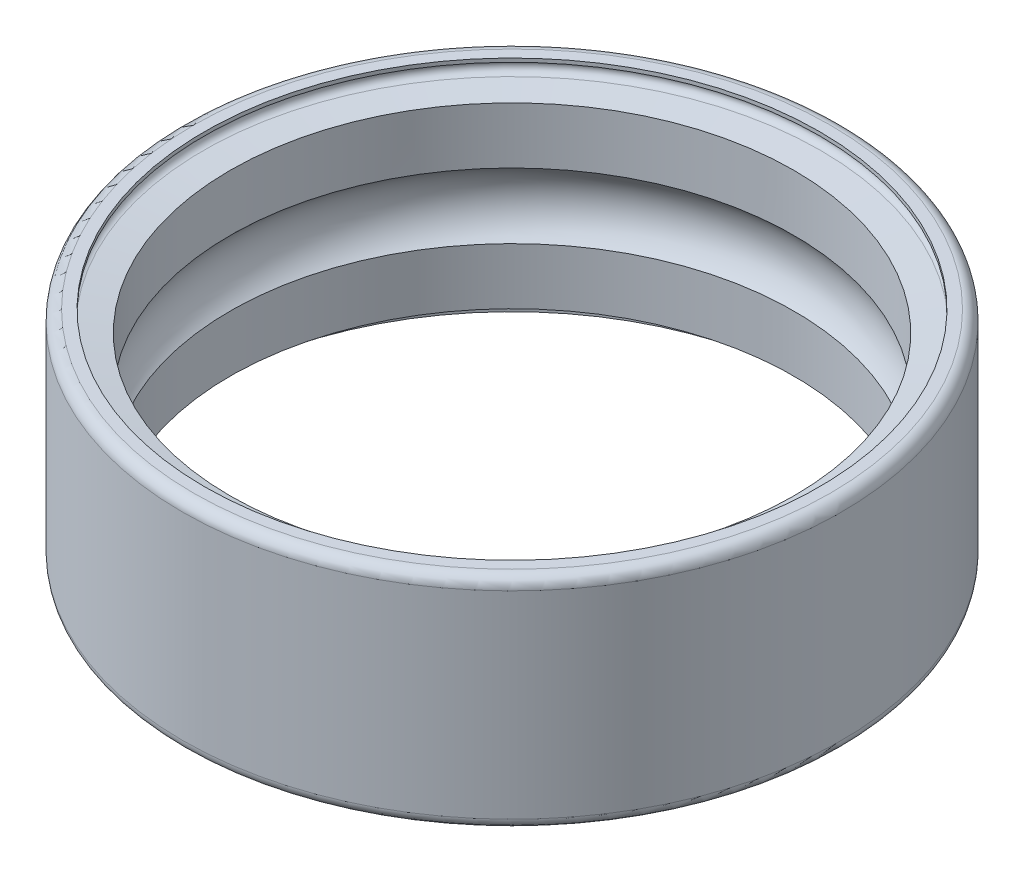
ISO-10303-21;
HEADER;
FILE_DESCRIPTION(('STEP AP214'),'2;1');
FILE_NAME('part.step','',(''),(''),'','','');
FILE_SCHEMA(('AUTOMOTIVE_DESIGN { 1 0 10303 214 1 1 1 1 }'));
ENDSEC;
DATA;
#1=APPLICATION_CONTEXT('core data for automotive mechanical design processes');
#2=APPLICATION_PROTOCOL_DEFINITION('international standard','automotive_design',2000,#1);
#3=PRODUCT_CONTEXT('',#1,'mechanical');
#4=PRODUCT('Part','Part','',(#3));
#5=PRODUCT_RELATED_PRODUCT_CATEGORY('part','',(#4));
#6=PRODUCT_DEFINITION_FORMATION('','',#4);
#7=PRODUCT_DEFINITION_CONTEXT('part definition',#1,'design');
#8=PRODUCT_DEFINITION('design','',#6,#7);
#9=PRODUCT_DEFINITION_SHAPE('','',#8);
#10=(LENGTH_UNIT() NAMED_UNIT(*) SI_UNIT(.MILLI.,.METRE.));
#11=(NAMED_UNIT(*) PLANE_ANGLE_UNIT() SI_UNIT($,.RADIAN.));
#12=(NAMED_UNIT(*) SI_UNIT($,.STERADIAN.) SOLID_ANGLE_UNIT());
#13=UNCERTAINTY_MEASURE_WITH_UNIT(LENGTH_MEASURE(1.E-05),#10,'distance_accuracy_value','');
#14=(GEOMETRIC_REPRESENTATION_CONTEXT(3) GLOBAL_UNCERTAINTY_ASSIGNED_CONTEXT((#13)) GLOBAL_UNIT_ASSIGNED_CONTEXT((#10,
#11,#12)) REPRESENTATION_CONTEXT('',''));
#15=CARTESIAN_POINT('',(0.,0.,0.));
#16=DIRECTION('',(0.,0.,1.));
#17=DIRECTION('',(1.,0.,0.));
#18=AXIS2_PLACEMENT_3D('',#15,#16,#17);
#19=CARTESIAN_POINT('',(0.,9.,0.));
#20=DIRECTION('',(0.,-1.,0.));
#21=DIRECTION('',(0.,0.,1.));
#22=AXIS2_PLACEMENT_3D('',#19,#20,#21);
#23=TOROIDAL_SURFACE('',#22,3.45,0.6);
#24=CARTESIAN_POINT('',(0.,8.55278640450005,0.));
#25=DIRECTION('',(0.,1.,0.));
#26=DIRECTION('',(0.,0.,1.));
#27=AXIS2_PLACEMENT_3D('',#24,#25,#26);
#28=CIRCLE('',#27,3.85);
#29=CARTESIAN_POINT('',(0.,8.55278640450005,3.85));
#30=VERTEX_POINT('',#29);
#31=EDGE_CURVE('E115',#30,#30,#28,.F.);
#32=ORIENTED_EDGE('',*,*,#31,.T.);
#33=EDGE_LOOP('',(#32));
#34=FACE_BOUND('',#33,.T.);
#35=CARTESIAN_POINT('',(0.,9.44721359549996,0.));
#36=DIRECTION('',(0.,1.,0.));
#37=DIRECTION('',(0.,0.,1.));
#38=AXIS2_PLACEMENT_3D('',#35,#36,#37);
#39=CIRCLE('',#38,3.85);
#40=CARTESIAN_POINT('',(0.,9.44721359549996,3.85));
#41=VERTEX_POINT('',#40);
#42=EDGE_CURVE('E111',#41,#41,#39,.T.);
#43=ORIENTED_EDGE('',*,*,#42,.T.);
#44=EDGE_LOOP('',(#43));
#45=FACE_BOUND('',#44,.T.);
#46=ADVANCED_FACE('F15',(#34,#45),#23,.F.);
#47=CARTESIAN_POINT('',(0.,0.5,0.));
#48=DIRECTION('',(0.,1.,0.));
#49=DIRECTION('',(0.,0.,1.));
#50=AXIS2_PLACEMENT_3D('',#47,#48,#49);
#51=CYLINDRICAL_SURFACE('',#50,3.85);
#52=CARTESIAN_POINT('',(0.,7.78278640449059,0.));
#53=DIRECTION('',(0.,-1.,0.));
#54=DIRECTION('',(0.,0.,1.));
#55=AXIS2_PLACEMENT_3D('',#52,#53,#54);
#56=CIRCLE('',#55,3.84999999999991);
#57=CARTESIAN_POINT('',(0.,7.78278640449059,3.84999999999991));
#58=VERTEX_POINT('',#57);
#59=EDGE_CURVE('E114',#58,#58,#56,.T.);
#60=ORIENTED_EDGE('',*,*,#59,.T.);
#61=EDGE_LOOP('',(#60));
#62=FACE_BOUND('',#61,.T.);
#63=ORIENTED_EDGE('',*,*,#31,.F.);
#64=EDGE_LOOP('',(#63));
#65=FACE_BOUND('',#64,.T.);
#66=ADVANCED_FACE('F155',(#62,#65),#51,.F.);
#67=CARTESIAN_POINT('',(0.,0.5,0.));
#68=DIRECTION('',(0.,1.,0.));
#69=DIRECTION('',(0.,0.,1.));
#70=AXIS2_PLACEMENT_3D('',#67,#68,#69);
#71=CYLINDRICAL_SURFACE('',#70,3.85);
#72=ORIENTED_EDGE('',*,*,#42,.F.);
#73=EDGE_LOOP('',(#72));
#74=FACE_BOUND('',#73,.T.);
#75=CARTESIAN_POINT('',(0.,10.2172135954959,0.));
#76=DIRECTION('',(0.,1.,0.));
#77=DIRECTION('',(0.,0.,-1.));
#78=AXIS2_PLACEMENT_3D('',#75,#76,#77);
#79=CIRCLE('',#78,3.84999999999991);
#80=CARTESIAN_POINT('',(0.,10.2172135954959,-3.84999999999991));
#81=VERTEX_POINT('',#80);
#82=EDGE_CURVE('E110',#81,#81,#79,.T.);
#83=ORIENTED_EDGE('',*,*,#82,.T.);
#84=EDGE_LOOP('',(#83));
#85=FACE_BOUND('',#84,.T.);
#86=ADVANCED_FACE('F151',(#74,#85),#71,.F.);
#87=CARTESIAN_POINT('',(0.,7.72903000742531,0.));
#88=DIRECTION('',(0.,-1.,0.));
#89=DIRECTION('',(1.,0.,0.));
#90=AXIS2_PLACEMENT_3D('',#87,#88,#89);
#91=CONICAL_SURFACE('',#90,4.21317792756782,1.42384660242299);
#92=CARTESIAN_POINT('',(0.,7.72903000743884,0.));
#93=DIRECTION('',(0.,-1.,0.));
#94=DIRECTION('',(0.,0.,1.));
#95=AXIS2_PLACEMENT_3D('',#92,#93,#94);
#96=CIRCLE('',#95,4.21317792758516);
#97=CARTESIAN_POINT('',(0.,7.72903000743884,4.21317792758516));
#98=VERTEX_POINT('',#97);
#99=EDGE_CURVE('E104',#98,#98,#96,.T.);
#100=ORIENTED_EDGE('',*,*,#99,.T.);
#101=EDGE_LOOP('',(#100));
#102=FACE_BOUND('',#101,.T.);
#103=ORIENTED_EDGE('',*,*,#59,.F.);
#104=EDGE_LOOP('',(#103));
#105=FACE_BOUND('',#104,.T.);
#106=ADVANCED_FACE('F148',(#102,#105),#91,.F.);
#107=CARTESIAN_POINT('',(0.,10.2709699925612,0.));
#108=DIRECTION('',(0.,1.,0.));
#109=DIRECTION('',(0.,0.,1.));
#110=AXIS2_PLACEMENT_3D('',#107,#108,#109);
#111=CONICAL_SURFACE('',#110,4.21317792756782,1.42384660242299);
#112=CARTESIAN_POINT('',(0.,10.2709699925612,0.));
#113=DIRECTION('',(0.,-1.,0.));
#114=DIRECTION('',(0.,0.,1.));
#115=AXIS2_PLACEMENT_3D('',#112,#113,#114);
#116=CIRCLE('',#115,4.21317792758517);
#117=CARTESIAN_POINT('',(0.,10.2709699925612,4.21317792758517));
#118=VERTEX_POINT('',#117);
#119=EDGE_CURVE('E101',#118,#118,#116,.F.);
#120=ORIENTED_EDGE('',*,*,#119,.T.);
#121=EDGE_LOOP('',(#120));
#122=FACE_BOUND('',#121,.T.);
#123=ORIENTED_EDGE('',*,*,#82,.F.);
#124=EDGE_LOOP('',(#123));
#125=FACE_BOUND('',#124,.T.);
#126=ADVANCED_FACE('F145',(#122,#125),#111,.F.);
#127=CARTESIAN_POINT('',(0.,7.64,0.));
#128=DIRECTION('',(0.,-1.,0.));
#129=DIRECTION('',(0.,0.,1.));
#130=AXIS2_PLACEMENT_3D('',#127,#128,#129);
#131=TOROIDAL_SURFACE('',#130,4.2,0.09);
#132=CARTESIAN_POINT('',(0.,7.55,0.));
#133=DIRECTION('',(0.,1.,0.));
#134=DIRECTION('',(0.,0.,1.));
#135=AXIS2_PLACEMENT_3D('',#132,#133,#134);
#136=CIRCLE('',#135,4.2);
#137=CARTESIAN_POINT('',(0.,7.55,4.2));
#138=VERTEX_POINT('',#137);
#139=EDGE_CURVE('E99',#138,#138,#136,.F.);
#140=ORIENTED_EDGE('',*,*,#139,.T.);
#141=EDGE_LOOP('',(#140));
#142=FACE_BOUND('',#141,.T.);
#143=ORIENTED_EDGE('',*,*,#99,.F.);
#144=EDGE_LOOP('',(#143));
#145=FACE_BOUND('',#144,.T.);
#146=ADVANCED_FACE('F92',(#142,#145),#131,.F.);
#147=CARTESIAN_POINT('',(0.,10.36,0.));
#148=DIRECTION('',(0.,-1.,0.));
#149=DIRECTION('',(0.,0.,1.));
#150=AXIS2_PLACEMENT_3D('',#147,#148,#149);
#151=TOROIDAL_SURFACE('',#150,4.2,0.0899999999999985);
#152=ORIENTED_EDGE('',*,*,#119,.F.);
#153=EDGE_LOOP('',(#152));
#154=FACE_BOUND('',#153,.T.);
#155=CARTESIAN_POINT('',(0.,10.45,0.));
#156=DIRECTION('',(0.,1.,0.));
#157=DIRECTION('',(0.,0.,1.));
#158=AXIS2_PLACEMENT_3D('',#155,#156,#157);
#159=CIRCLE('',#158,4.2);
#160=CARTESIAN_POINT('',(0.,10.45,4.2));
#161=VERTEX_POINT('',#160);
#162=EDGE_CURVE('E127',#161,#161,#159,.T.);
#163=ORIENTED_EDGE('',*,*,#162,.T.);
#164=EDGE_LOOP('',(#163));
#165=FACE_BOUND('',#164,.T.);
#166=ADVANCED_FACE('F87',(#154,#165),#151,.F.);
#167=CARTESIAN_POINT('',(0.,0.5,0.));
#168=DIRECTION('',(0.,1.,0.));
#169=DIRECTION('',(0.,0.,1.));
#170=AXIS2_PLACEMENT_3D('',#167,#168,#169);
#171=CYLINDRICAL_SURFACE('',#170,4.2);
#172=CARTESIAN_POINT('',(0.,7.5,0.));
#173=DIRECTION('',(0.,1.,0.));
#174=DIRECTION('',(0.,0.,1.));
#175=AXIS2_PLACEMENT_3D('',#172,#173,#174);
#176=CIRCLE('',#175,4.2);
#177=CARTESIAN_POINT('',(0.,7.5,4.2));
#178=VERTEX_POINT('',#177);
#179=EDGE_CURVE('E19',#178,#178,#176,.F.);
#180=ORIENTED_EDGE('',*,*,#179,.T.);
#181=EDGE_LOOP('',(#180));
#182=FACE_BOUND('',#181,.T.);
#183=ORIENTED_EDGE('',*,*,#139,.F.);
#184=EDGE_LOOP('',(#183));
#185=FACE_BOUND('',#184,.T.);
#186=ADVANCED_FACE('F83',(#182,#185),#171,.F.);
#187=CARTESIAN_POINT('',(0.,0.5,0.));
#188=DIRECTION('',(0.,1.,0.));
#189=DIRECTION('',(0.,0.,1.));
#190=AXIS2_PLACEMENT_3D('',#187,#188,#189);
#191=CYLINDRICAL_SURFACE('',#190,4.2);
#192=ORIENTED_EDGE('',*,*,#162,.F.);
#193=EDGE_LOOP('',(#192));
#194=FACE_BOUND('',#193,.T.);
#195=CARTESIAN_POINT('',(0.,10.5,0.));
#196=DIRECTION('',(0.,1.,0.));
#197=DIRECTION('',(0.,0.,1.));
#198=AXIS2_PLACEMENT_3D('',#195,#196,#197);
#199=CIRCLE('',#198,4.2);
#200=CARTESIAN_POINT('',(0.,10.5,4.2));
#201=VERTEX_POINT('',#200);
#202=EDGE_CURVE('E122',#201,#201,#199,.T.);
#203=ORIENTED_EDGE('',*,*,#202,.T.);
#204=EDGE_LOOP('',(#203));
#205=FACE_BOUND('',#204,.T.);
#206=ADVANCED_FACE('F78',(#194,#205),#191,.F.);
#207=CARTESIAN_POINT('',(4.35,7.5,0.));
#208=DIRECTION('',(0.,1.,0.));
#209=DIRECTION('',(0.,0.,1.));
#210=AXIS2_PLACEMENT_3D('',#207,#208,#209);
#211=PLANE('',#210);
#212=ORIENTED_EDGE('',*,*,#179,.F.);
#213=EDGE_LOOP('',(#212));
#214=FACE_BOUND('',#213,.T.);
#215=CARTESIAN_POINT('',(0.,7.5,0.));
#216=DIRECTION('',(0.,1.,0.));
#217=DIRECTION('',(0.,0.,-1.));
#218=AXIS2_PLACEMENT_3D('',#215,#216,#217);
#219=CIRCLE('',#218,4.35);
#220=CARTESIAN_POINT('',(0.,7.5,-4.35));
#221=VERTEX_POINT('',#220);
#222=EDGE_CURVE('E62',#221,#221,#219,.T.);
#223=ORIENTED_EDGE('',*,*,#222,.F.);
#224=EDGE_LOOP('',(#223));
#225=FACE_BOUND('',#224,.T.);
#226=ADVANCED_FACE('F68',(#214,#225),#211,.F.);
#227=CARTESIAN_POINT('',(4.35,10.5,0.));
#228=DIRECTION('',(0.,-1.,0.));
#229=DIRECTION('',(0.,0.,-1.));
#230=AXIS2_PLACEMENT_3D('',#227,#228,#229);
#231=PLANE('',#230);
#232=ORIENTED_EDGE('',*,*,#202,.F.);
#233=EDGE_LOOP('',(#232));
#234=FACE_BOUND('',#233,.T.);
#235=CARTESIAN_POINT('',(0.,10.5,0.));
#236=DIRECTION('',(0.,-1.,0.));
#237=DIRECTION('',(0.,0.,-1.));
#238=AXIS2_PLACEMENT_3D('',#235,#236,#237);
#239=CIRCLE('',#238,4.35);
#240=CARTESIAN_POINT('',(0.,10.5,-4.35));
#241=VERTEX_POINT('',#240);
#242=EDGE_CURVE('E28',#241,#241,#239,.T.);
#243=ORIENTED_EDGE('',*,*,#242,.F.);
#244=EDGE_LOOP('',(#243));
#245=FACE_BOUND('',#244,.T.);
#246=ADVANCED_FACE('F77',(#234,#245),#231,.F.);
#247=CARTESIAN_POINT('',(0.,7.65,0.));
#248=DIRECTION('',(0.,-1.,0.));
#249=DIRECTION('',(0.,0.,1.));
#250=AXIS2_PLACEMENT_3D('',#247,#248,#249);
#251=TOROIDAL_SURFACE('',#250,4.35,0.15);
#252=CARTESIAN_POINT('',(0.,7.65,0.));
#253=DIRECTION('',(0.,1.,0.));
#254=DIRECTION('',(0.,0.,1.));
#255=AXIS2_PLACEMENT_3D('',#252,#253,#254);
#256=CIRCLE('',#255,4.5);
#257=CARTESIAN_POINT('',(0.,7.65,4.5));
#258=VERTEX_POINT('',#257);
#259=EDGE_CURVE('E23',#258,#258,#256,.T.);
#260=ORIENTED_EDGE('',*,*,#259,.F.);
#261=EDGE_LOOP('',(#260));
#262=FACE_BOUND('',#261,.T.);
#263=ORIENTED_EDGE('',*,*,#222,.T.);
#264=EDGE_LOOP('',(#263));
#265=FACE_BOUND('',#264,.T.);
#266=ADVANCED_FACE('F42',(#262,#265),#251,.T.);
#267=CARTESIAN_POINT('',(0.,10.35,0.));
#268=DIRECTION('',(0.,-1.,0.));
#269=DIRECTION('',(0.,0.,1.));
#270=AXIS2_PLACEMENT_3D('',#267,#268,#269);
#271=TOROIDAL_SURFACE('',#270,4.35,0.149999999999998);
#272=ORIENTED_EDGE('',*,*,#242,.T.);
#273=EDGE_LOOP('',(#272));
#274=FACE_BOUND('',#273,.T.);
#275=CARTESIAN_POINT('',(0.,10.35,0.));
#276=DIRECTION('',(0.,1.,0.));
#277=DIRECTION('',(0.,0.,1.));
#278=AXIS2_PLACEMENT_3D('',#275,#276,#277);
#279=CIRCLE('',#278,4.5);
#280=CARTESIAN_POINT('',(0.,10.35,4.5));
#281=VERTEX_POINT('',#280);
#282=EDGE_CURVE('E10',#281,#281,#279,.F.);
#283=ORIENTED_EDGE('',*,*,#282,.F.);
#284=EDGE_LOOP('',(#283));
#285=FACE_BOUND('',#284,.T.);
#286=ADVANCED_FACE('F36',(#274,#285),#271,.T.);
#287=CARTESIAN_POINT('',(0.,0.5,0.));
#288=DIRECTION('',(0.,1.,0.));
#289=DIRECTION('',(0.,0.,1.));
#290=AXIS2_PLACEMENT_3D('',#287,#288,#289);
#291=CYLINDRICAL_SURFACE('',#290,4.5);
#292=ORIENTED_EDGE('',*,*,#282,.T.);
#293=EDGE_LOOP('',(#292));
#294=FACE_BOUND('',#293,.T.);
#295=ORIENTED_EDGE('',*,*,#259,.T.);
#296=EDGE_LOOP('',(#295));
#297=FACE_BOUND('',#296,.T.);
#298=ADVANCED_FACE('F41',(#294,#297),#291,.T.);
#299=CLOSED_SHELL('',(#46,#66,#86,#106,#126,#146,#166,#186,#206,#226,#246,#266,#286,#298));
#300=MANIFOLD_SOLID_BREP('B1',#299);
#301=ADVANCED_BREP_SHAPE_REPRESENTATION('',(#18,#300),#14);
#302=SHAPE_DEFINITION_REPRESENTATION(#9,#301);
ENDSEC;
END-ISO-10303-21;
